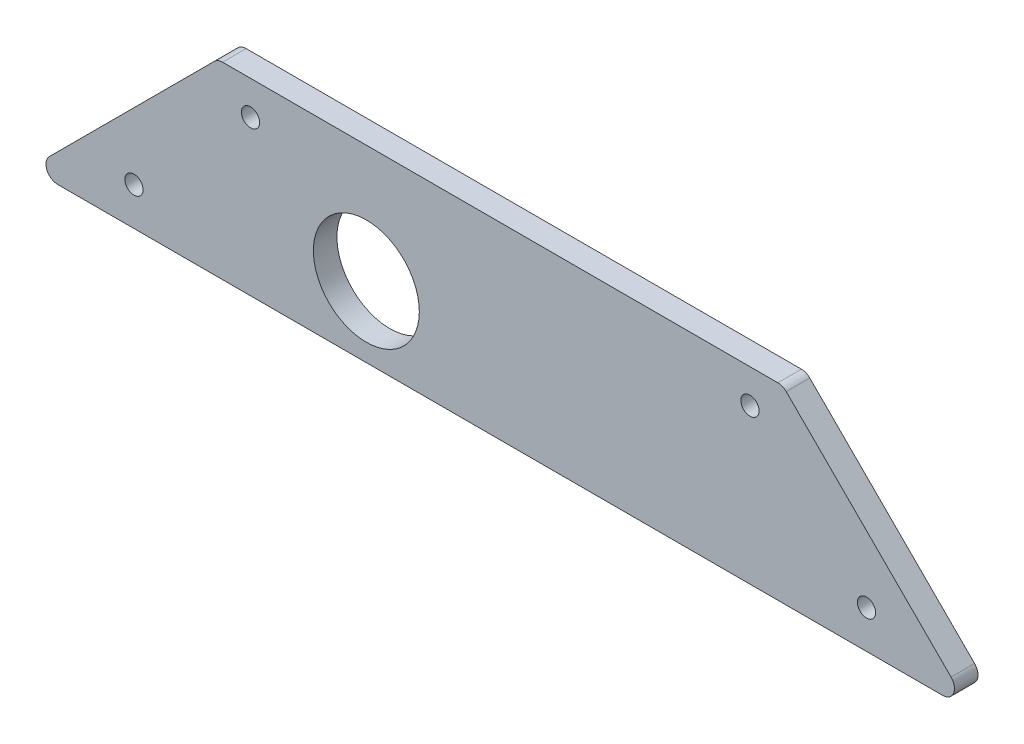
ISO-10303-21;
HEADER;
FILE_DESCRIPTION(('STEP AP214'),'2;1');
FILE_NAME('part.step','',(''),(''),'','','');
FILE_SCHEMA(('AUTOMOTIVE_DESIGN { 1 0 10303 214 1 1 1 1 }'));
ENDSEC;
DATA;
#1=APPLICATION_CONTEXT('core data for automotive mechanical design processes');
#2=APPLICATION_PROTOCOL_DEFINITION('international standard','automotive_design',2000,#1);
#3=PRODUCT_CONTEXT('',#1,'mechanical');
#4=PRODUCT('Part','Part','',(#3));
#5=PRODUCT_RELATED_PRODUCT_CATEGORY('part','',(#4));
#6=PRODUCT_DEFINITION_FORMATION('','',#4);
#7=PRODUCT_DEFINITION_CONTEXT('part definition',#1,'design');
#8=PRODUCT_DEFINITION('design','',#6,#7);
#9=PRODUCT_DEFINITION_SHAPE('','',#8);
#10=(LENGTH_UNIT() NAMED_UNIT(*) SI_UNIT(.MILLI.,.METRE.));
#11=(NAMED_UNIT(*) PLANE_ANGLE_UNIT() SI_UNIT($,.RADIAN.));
#12=(NAMED_UNIT(*) SI_UNIT($,.STERADIAN.) SOLID_ANGLE_UNIT());
#13=UNCERTAINTY_MEASURE_WITH_UNIT(LENGTH_MEASURE(1.E-05),#10,'distance_accuracy_value','');
#14=(GEOMETRIC_REPRESENTATION_CONTEXT(3) GLOBAL_UNCERTAINTY_ASSIGNED_CONTEXT((#13)) GLOBAL_UNIT_ASSIGNED_CONTEXT((#10,
#11,#12)) REPRESENTATION_CONTEXT('',''));
#15=CARTESIAN_POINT('',(0.,0.,0.));
#16=DIRECTION('',(0.,0.,1.));
#17=DIRECTION('',(1.,0.,0.));
#18=AXIS2_PLACEMENT_3D('',#15,#16,#17);
#19=CARTESIAN_POINT('',(-76.1999999999995,29.1621533831808,3.175));
#20=DIRECTION('',(0.,-1.,0.));
#21=DIRECTION('',(1.,0.,0.));
#22=AXIS2_PLACEMENT_3D('',#19,#20,#21);
#23=PLANE('',#22);
#24=DIRECTION('',(-1.,0.,0.));
#25=VECTOR('',#24,1.);
#26=CARTESIAN_POINT('',(-76.1999999999995,29.1621533831808,-3.175));
#27=LINE('',#26,#25);
#28=CARTESIAN_POINT('',(74.8848719394649,29.1621533831808,-3.175));
#29=VERTEX_POINT('',#28);
#30=CARTESIAN_POINT('',(-74.8848719394649,29.1621533831808,-3.175));
#31=VERTEX_POINT('',#30);
#32=EDGE_CURVE('E132',#29,#31,#27,.T.);
#33=ORIENTED_EDGE('',*,*,#32,.T.);
#34=DIRECTION('',(0.,0.,-1.));
#35=VECTOR('',#34,1.);
#36=CARTESIAN_POINT('',(-74.8848719394649,29.1621533831808,3.175));
#37=LINE('',#36,#35);
#38=CARTESIAN_POINT('',(-74.8848719394649,29.1621533831808,3.175));
#39=VERTEX_POINT('',#38);
#40=EDGE_CURVE('E154',#31,#39,#37,.F.);
#41=ORIENTED_EDGE('',*,*,#40,.T.);
#42=DIRECTION('',(-1.,0.,0.));
#43=VECTOR('',#42,1.);
#44=CARTESIAN_POINT('',(-76.1999999999995,29.1621533831808,3.175));
#45=LINE('',#44,#43);
#46=CARTESIAN_POINT('',(74.8848719394649,29.1621533831808,3.175));
#47=VERTEX_POINT('',#46);
#48=EDGE_CURVE('E130',#47,#39,#45,.T.);
#49=ORIENTED_EDGE('',*,*,#48,.F.);
#50=DIRECTION('',(0.,0.,-1.));
#51=VECTOR('',#50,1.);
#52=CARTESIAN_POINT('',(74.8848719394649,29.1621533831808,3.175));
#53=LINE('',#52,#51);
#54=EDGE_CURVE('E151',#47,#29,#53,.T.);
#55=ORIENTED_EDGE('',*,*,#54,.T.);
#56=EDGE_LOOP('',(#33,#41,#49,#55));
#57=FACE_BOUND('',#56,.T.);
#58=ADVANCED_FACE('F35',(#57),#23,.F.);
#59=CARTESIAN_POINT('',(-76.1999999999995,29.1621533831808,3.175));
#60=DIRECTION('',(0.707106781186544,-0.707106781186551,0.));
#61=DIRECTION('',(0.707106781186551,0.707106781186544,0.));
#62=AXIS2_PLACEMENT_3D('',#59,#60,#61);
#63=PLANE('',#62);
#64=DIRECTION('',(-0.707106781186551,-0.707106781186544,0.));
#65=VECTOR('',#64,1.);
#66=CARTESIAN_POINT('',(-76.1999999999995,29.1621533831808,-3.175));
#67=LINE('',#66,#65);
#68=CARTESIAN_POINT('',(-77.1299359697322,28.2322174134481,-3.175));
#69=VERTEX_POINT('',#68);
#70=CARTESIAN_POINT('',(-121.579935969733,-16.2177825865519,-3.175));
#71=VERTEX_POINT('',#70);
#72=EDGE_CURVE('E128',#69,#71,#67,.T.);
#73=ORIENTED_EDGE('',*,*,#72,.T.);
#74=DIRECTION('',(0.,0.,-1.));
#75=VECTOR('',#74,1.);
#76=CARTESIAN_POINT('',(-121.579935969733,-16.2177825865519,3.175));
#77=LINE('',#76,#75);
#78=CARTESIAN_POINT('',(-121.579935969733,-16.2177825865519,3.175));
#79=VERTEX_POINT('',#78);
#80=EDGE_CURVE('E106',#71,#79,#77,.F.);
#81=ORIENTED_EDGE('',*,*,#80,.T.);
#82=DIRECTION('',(-0.707106781186551,-0.707106781186544,0.));
#83=VECTOR('',#82,1.);
#84=CARTESIAN_POINT('',(-76.1999999999995,29.1621533831808,3.175));
#85=LINE('',#84,#83);
#86=CARTESIAN_POINT('',(-77.1299359697322,28.2322174134481,3.175));
#87=VERTEX_POINT('',#86);
#88=EDGE_CURVE('E168',#87,#79,#85,.T.);
#89=ORIENTED_EDGE('',*,*,#88,.F.);
#90=DIRECTION('',(0.,0.,-1.));
#91=VECTOR('',#90,1.);
#92=CARTESIAN_POINT('',(-77.1299359697322,28.2322174134481,3.175));
#93=LINE('',#92,#91);
#94=EDGE_CURVE('E111',#87,#69,#93,.T.);
#95=ORIENTED_EDGE('',*,*,#94,.T.);
#96=EDGE_LOOP('',(#73,#81,#89,#95));
#97=FACE_BOUND('',#96,.T.);
#98=ADVANCED_FACE('F173',(#97),#63,.F.);
#99=CARTESIAN_POINT('',(-127.,-21.6378466168192,3.175));
#100=DIRECTION('',(0.,1.,0.));
#101=DIRECTION('',(0.,0.,1.));
#102=AXIS2_PLACEMENT_3D('',#99,#100,#101);
#103=PLANE('',#102);
#104=DIRECTION('',(1.,0.,0.));
#105=VECTOR('',#104,1.);
#106=CARTESIAN_POINT('',(-127.,-21.6378466168192,3.175));
#107=LINE('',#106,#105);
#108=CARTESIAN_POINT('',(-119.334871939465,-21.6378466168192,3.175));
#109=VERTEX_POINT('',#108);
#110=CARTESIAN_POINT('',(119.334871939465,-21.6378466168192,3.175));
#111=VERTEX_POINT('',#110);
#112=EDGE_CURVE('E120',#109,#111,#107,.T.);
#113=ORIENTED_EDGE('',*,*,#112,.F.);
#114=DIRECTION('',(0.,0.,-1.));
#115=VECTOR('',#114,1.);
#116=CARTESIAN_POINT('',(-119.334871939465,-21.6378466168192,3.175));
#117=LINE('',#116,#115);
#118=CARTESIAN_POINT('',(-119.334871939465,-21.6378466168192,-3.175));
#119=VERTEX_POINT('',#118);
#120=EDGE_CURVE('E105',#109,#119,#117,.T.);
#121=ORIENTED_EDGE('',*,*,#120,.T.);
#122=DIRECTION('',(1.,0.,0.));
#123=VECTOR('',#122,1.);
#124=CARTESIAN_POINT('',(-127.,-21.6378466168192,-3.175));
#125=LINE('',#124,#123);
#126=CARTESIAN_POINT('',(119.334871939465,-21.6378466168192,-3.175));
#127=VERTEX_POINT('',#126);
#128=EDGE_CURVE('E118',#119,#127,#125,.T.);
#129=ORIENTED_EDGE('',*,*,#128,.T.);
#130=DIRECTION('',(0.,0.,-1.));
#131=VECTOR('',#130,1.);
#132=CARTESIAN_POINT('',(119.334871939465,-21.6378466168192,3.175));
#133=LINE('',#132,#131);
#134=EDGE_CURVE('E122',#127,#111,#133,.F.);
#135=ORIENTED_EDGE('',*,*,#134,.T.);
#136=EDGE_LOOP('',(#113,#121,#129,#135));
#137=FACE_BOUND('',#136,.T.);
#138=ADVANCED_FACE('F117',(#137),#103,.F.);
#139=CARTESIAN_POINT('',(127.,-21.6378466168192,3.175));
#140=DIRECTION('',(-0.707106781186543,-0.707106781186551,0.));
#141=DIRECTION('',(0.707106781186551,-0.707106781186544,0.));
#142=AXIS2_PLACEMENT_3D('',#139,#140,#141);
#143=PLANE('',#142);
#144=DIRECTION('',(-0.707106781186552,0.707106781186544,0.));
#145=VECTOR('',#144,1.);
#146=CARTESIAN_POINT('',(127.,-21.6378466168192,3.175));
#147=LINE('',#146,#145);
#148=CARTESIAN_POINT('',(121.579935969733,-16.2177825865519,3.175));
#149=VERTEX_POINT('',#148);
#150=CARTESIAN_POINT('',(77.1299359697321,28.2322174134481,3.175));
#151=VERTEX_POINT('',#150);
#152=EDGE_CURVE('E136',#149,#151,#147,.T.);
#153=ORIENTED_EDGE('',*,*,#152,.F.);
#154=DIRECTION('',(0.,0.,-1.));
#155=VECTOR('',#154,1.);
#156=CARTESIAN_POINT('',(121.579935969733,-16.2177825865519,3.175));
#157=LINE('',#156,#155);
#158=CARTESIAN_POINT('',(121.579935969733,-16.2177825865519,-3.175));
#159=VERTEX_POINT('',#158);
#160=EDGE_CURVE('E11',#149,#159,#157,.T.);
#161=ORIENTED_EDGE('',*,*,#160,.T.);
#162=DIRECTION('',(-0.707106781186552,0.707106781186544,0.));
#163=VECTOR('',#162,1.);
#164=CARTESIAN_POINT('',(127.,-21.6378466168192,-3.175));
#165=LINE('',#164,#163);
#166=CARTESIAN_POINT('',(77.1299359697321,28.2322174134481,-3.175));
#167=VERTEX_POINT('',#166);
#168=EDGE_CURVE('E127',#159,#167,#165,.T.);
#169=ORIENTED_EDGE('',*,*,#168,.T.);
#170=DIRECTION('',(0.,0.,-1.));
#171=VECTOR('',#170,1.);
#172=CARTESIAN_POINT('',(77.1299359697322,28.2322174134481,3.175));
#173=LINE('',#172,#171);
#174=EDGE_CURVE('E43',#167,#151,#173,.F.);
#175=ORIENTED_EDGE('',*,*,#174,.T.);
#176=EDGE_LOOP('',(#153,#161,#169,#175));
#177=FACE_BOUND('',#176,.T.);
#178=ADVANCED_FACE('F213',(#177),#143,.F.);
#179=CARTESIAN_POINT('',(0.,0.,3.175));
#180=DIRECTION('',(0.,0.,1.));
#181=DIRECTION('',(1.,0.,0.));
#182=AXIS2_PLACEMENT_3D('',#179,#180,#181);
#183=PLANE('',#182);
#184=CARTESIAN_POINT('',(67.3519209080186,20.0497202330234,3.175));
#185=DIRECTION('',(0.,0.,1.));
#186=DIRECTION('',(1.,0.,0.));
#187=AXIS2_PLACEMENT_3D('',#184,#185,#186);
#188=CIRCLE('',#187,2.45744999999999);
#189=CARTESIAN_POINT('',(69.8093709080186,20.0497202330234,3.175));
#190=VERTEX_POINT('',#189);
#191=EDGE_CURVE('E205',#190,#190,#188,.T.);
#192=ORIENTED_EDGE('',*,*,#191,.F.);
#193=EDGE_LOOP('',(#192));
#194=FACE_BOUND('',#193,.T.);
#195=CARTESIAN_POINT('',(98.7828173317607,-11.3811761907187,3.175));
#196=DIRECTION('',(0.,0.,1.));
#197=DIRECTION('',(1.,0.,0.));
#198=AXIS2_PLACEMENT_3D('',#195,#196,#197);
#199=CIRCLE('',#198,2.45744999999999);
#200=CARTESIAN_POINT('',(101.240267331761,-11.3811761907187,3.175));
#201=VERTEX_POINT('',#200);
#202=EDGE_CURVE('E199',#201,#201,#199,.T.);
#203=ORIENTED_EDGE('',*,*,#202,.F.);
#204=EDGE_LOOP('',(#203));
#205=FACE_BOUND('',#204,.T.);
#206=CARTESIAN_POINT('',(-67.3519209080187,20.0497202330234,3.175));
#207=DIRECTION('',(0.,0.,1.));
#208=DIRECTION('',(1.,0.,0.));
#209=AXIS2_PLACEMENT_3D('',#206,#207,#208);
#210=CIRCLE('',#209,2.45744999999999);
#211=CARTESIAN_POINT('',(-64.8944709080187,20.0497202330234,3.175));
#212=VERTEX_POINT('',#211);
#213=EDGE_CURVE('E193',#212,#212,#210,.T.);
#214=ORIENTED_EDGE('',*,*,#213,.F.);
#215=EDGE_LOOP('',(#214));
#216=FACE_BOUND('',#215,.T.);
#217=CARTESIAN_POINT('',(-98.7828173317607,-11.3811761907187,3.175));
#218=DIRECTION('',(0.,0.,1.));
#219=DIRECTION('',(1.,0.,0.));
#220=AXIS2_PLACEMENT_3D('',#217,#218,#219);
#221=CIRCLE('',#220,2.45744999999999);
#222=CARTESIAN_POINT('',(-96.3253673317607,-11.3811761907187,3.175));
#223=VERTEX_POINT('',#222);
#224=EDGE_CURVE('E187',#223,#223,#221,.T.);
#225=ORIENTED_EDGE('',*,*,#224,.F.);
#226=EDGE_LOOP('',(#225));
#227=FACE_BOUND('',#226,.T.);
#228=CARTESIAN_POINT('',(-36.1079510314463,-2.58784661681916,3.175));
#229=DIRECTION('',(0.,0.,1.));
#230=DIRECTION('',(1.,0.,0.));
#231=AXIS2_PLACEMENT_3D('',#228,#229,#230);
#232=CIRCLE('',#231,14.2875);
#233=CARTESIAN_POINT('',(-21.8204510314463,-2.58784661681916,3.175));
#234=VERTEX_POINT('',#233);
#235=EDGE_CURVE('E176',#234,#234,#232,.T.);
#236=ORIENTED_EDGE('',*,*,#235,.F.);
#237=EDGE_LOOP('',(#236));
#238=FACE_BOUND('',#237,.T.);
#239=ORIENTED_EDGE('',*,*,#88,.T.);
#240=CARTESIAN_POINT('',(-119.334871939465,-18.4628466168192,3.175));
#241=DIRECTION('',(0.,0.,1.));
#242=DIRECTION('',(1.,0.,0.));
#243=AXIS2_PLACEMENT_3D('',#240,#241,#242);
#244=CIRCLE('',#243,3.175);
#245=EDGE_CURVE('E149',#79,#109,#244,.T.);
#246=ORIENTED_EDGE('',*,*,#245,.T.);
#247=ORIENTED_EDGE('',*,*,#112,.T.);
#248=CARTESIAN_POINT('',(119.334871939465,-18.4628466168192,3.175));
#249=DIRECTION('',(0.,0.,1.));
#250=DIRECTION('',(1.,0.,0.));
#251=AXIS2_PLACEMENT_3D('',#248,#249,#250);
#252=CIRCLE('',#251,3.175);
#253=EDGE_CURVE('E56',#111,#149,#252,.T.);
#254=ORIENTED_EDGE('',*,*,#253,.T.);
#255=ORIENTED_EDGE('',*,*,#152,.T.);
#256=CARTESIAN_POINT('',(74.8848719394649,25.9871533831808,3.175));
#257=DIRECTION('',(0.,0.,1.));
#258=DIRECTION('',(1.,0.,0.));
#259=AXIS2_PLACEMENT_3D('',#256,#257,#258);
#260=CIRCLE('',#259,3.175);
#261=EDGE_CURVE('E144',#151,#47,#260,.T.);
#262=ORIENTED_EDGE('',*,*,#261,.T.);
#263=ORIENTED_EDGE('',*,*,#48,.T.);
#264=CARTESIAN_POINT('',(-74.8848719394649,25.9871533831808,3.175));
#265=DIRECTION('',(0.,0.,1.));
#266=DIRECTION('',(1.,0.,0.));
#267=AXIS2_PLACEMENT_3D('',#264,#265,#266);
#268=CIRCLE('',#267,3.175);
#269=EDGE_CURVE('E147',#39,#87,#268,.T.);
#270=ORIENTED_EDGE('',*,*,#269,.T.);
#271=EDGE_LOOP('',(#239,#246,#247,#254,#255,#262,#263,#270));
#272=FACE_BOUND('',#271,.T.);
#273=ADVANCED_FACE('F165',(#194,#205,#216,#227,#238,#272),#183,.T.);
#274=CARTESIAN_POINT('',(0.,0.,-3.175));
#275=DIRECTION('',(0.,0.,1.));
#276=DIRECTION('',(1.,0.,0.));
#277=AXIS2_PLACEMENT_3D('',#274,#275,#276);
#278=PLANE('',#277);
#279=CARTESIAN_POINT('',(67.3519209080186,20.0497202330234,-3.17499999999999));
#280=DIRECTION('',(0.,0.,1.));
#281=DIRECTION('',(1.,0.,0.));
#282=AXIS2_PLACEMENT_3D('',#279,#280,#281);
#283=CIRCLE('',#282,2.45744999999999);
#284=CARTESIAN_POINT('',(69.8093709080186,20.0497202330234,-3.17499999999999));
#285=VERTEX_POINT('',#284);
#286=EDGE_CURVE('E202',#285,#285,#283,.T.);
#287=ORIENTED_EDGE('',*,*,#286,.T.);
#288=EDGE_LOOP('',(#287));
#289=FACE_BOUND('',#288,.T.);
#290=CARTESIAN_POINT('',(98.7828173317607,-11.3811761907187,-3.17499999999999));
#291=DIRECTION('',(0.,0.,1.));
#292=DIRECTION('',(1.,0.,0.));
#293=AXIS2_PLACEMENT_3D('',#290,#291,#292);
#294=CIRCLE('',#293,2.45744999999999);
#295=CARTESIAN_POINT('',(101.240267331761,-11.3811761907187,-3.17499999999999));
#296=VERTEX_POINT('',#295);
#297=EDGE_CURVE('E196',#296,#296,#294,.T.);
#298=ORIENTED_EDGE('',*,*,#297,.T.);
#299=EDGE_LOOP('',(#298));
#300=FACE_BOUND('',#299,.T.);
#301=CARTESIAN_POINT('',(-67.3519209080187,20.0497202330234,-3.17499999999999));
#302=DIRECTION('',(0.,0.,1.));
#303=DIRECTION('',(1.,0.,0.));
#304=AXIS2_PLACEMENT_3D('',#301,#302,#303);
#305=CIRCLE('',#304,2.45744999999999);
#306=CARTESIAN_POINT('',(-64.8944709080187,20.0497202330234,-3.17499999999999));
#307=VERTEX_POINT('',#306);
#308=EDGE_CURVE('E190',#307,#307,#305,.T.);
#309=ORIENTED_EDGE('',*,*,#308,.T.);
#310=EDGE_LOOP('',(#309));
#311=FACE_BOUND('',#310,.T.);
#312=CARTESIAN_POINT('',(-98.7828173317607,-11.3811761907187,-3.17499999999999));
#313=DIRECTION('',(0.,0.,1.));
#314=DIRECTION('',(1.,0.,0.));
#315=AXIS2_PLACEMENT_3D('',#312,#313,#314);
#316=CIRCLE('',#315,2.45744999999999);
#317=CARTESIAN_POINT('',(-96.3253673317607,-11.3811761907187,-3.17499999999999));
#318=VERTEX_POINT('',#317);
#319=EDGE_CURVE('E183',#318,#318,#316,.T.);
#320=ORIENTED_EDGE('',*,*,#319,.T.);
#321=EDGE_LOOP('',(#320));
#322=FACE_BOUND('',#321,.T.);
#323=CARTESIAN_POINT('',(-36.1079510314463,-2.58784661681916,-3.175));
#324=DIRECTION('',(0.,0.,1.));
#325=DIRECTION('',(1.,0.,0.));
#326=AXIS2_PLACEMENT_3D('',#323,#324,#325);
#327=CIRCLE('',#326,14.2875);
#328=CARTESIAN_POINT('',(-21.8204510314463,-2.58784661681916,-3.175));
#329=VERTEX_POINT('',#328);
#330=EDGE_CURVE('E174',#329,#329,#327,.T.);
#331=ORIENTED_EDGE('',*,*,#330,.T.);
#332=EDGE_LOOP('',(#331));
#333=FACE_BOUND('',#332,.T.);
#334=ORIENTED_EDGE('',*,*,#128,.F.);
#335=CARTESIAN_POINT('',(-119.334871939465,-18.4628466168192,-3.175));
#336=DIRECTION('',(0.,0.,1.));
#337=DIRECTION('',(1.,0.,0.));
#338=AXIS2_PLACEMENT_3D('',#335,#336,#337);
#339=CIRCLE('',#338,3.175);
#340=EDGE_CURVE('E101',#119,#71,#339,.F.);
#341=ORIENTED_EDGE('',*,*,#340,.T.);
#342=ORIENTED_EDGE('',*,*,#72,.F.);
#343=CARTESIAN_POINT('',(-74.8848719394649,25.9871533831808,-3.175));
#344=DIRECTION('',(0.,0.,1.));
#345=DIRECTION('',(1.,0.,0.));
#346=AXIS2_PLACEMENT_3D('',#343,#344,#345);
#347=CIRCLE('',#346,3.175);
#348=EDGE_CURVE('E112',#69,#31,#347,.F.);
#349=ORIENTED_EDGE('',*,*,#348,.T.);
#350=ORIENTED_EDGE('',*,*,#32,.F.);
#351=CARTESIAN_POINT('',(74.8848719394649,25.9871533831808,-3.175));
#352=DIRECTION('',(0.,0.,1.));
#353=DIRECTION('',(1.,0.,0.));
#354=AXIS2_PLACEMENT_3D('',#351,#352,#353);
#355=CIRCLE('',#354,3.175);
#356=EDGE_CURVE('E121',#29,#167,#355,.F.);
#357=ORIENTED_EDGE('',*,*,#356,.T.);
#358=ORIENTED_EDGE('',*,*,#168,.F.);
#359=CARTESIAN_POINT('',(119.334871939465,-18.4628466168192,-3.175));
#360=DIRECTION('',(0.,0.,1.));
#361=DIRECTION('',(1.,0.,0.));
#362=AXIS2_PLACEMENT_3D('',#359,#360,#361);
#363=CIRCLE('',#362,3.175);
#364=EDGE_CURVE('E126',#159,#127,#363,.F.);
#365=ORIENTED_EDGE('',*,*,#364,.T.);
#366=EDGE_LOOP('',(#334,#341,#342,#349,#350,#357,#358,#365));
#367=FACE_BOUND('',#366,.T.);
#368=ADVANCED_FACE('F124',(#289,#300,#311,#322,#333,#367),#278,.F.);
#369=CARTESIAN_POINT('',(-36.1079510314463,-2.58784661681916,-3.175));
#370=DIRECTION('',(0.,0.,1.));
#371=DIRECTION('',(1.,0.,0.));
#372=AXIS2_PLACEMENT_3D('',#369,#370,#371);
#373=CYLINDRICAL_SURFACE('',#372,14.2875);
#374=ORIENTED_EDGE('',*,*,#330,.F.);
#375=EDGE_LOOP('',(#374));
#376=FACE_BOUND('',#375,.T.);
#377=ORIENTED_EDGE('',*,*,#235,.T.);
#378=EDGE_LOOP('',(#377));
#379=FACE_BOUND('',#378,.T.);
#380=ADVANCED_FACE('F223',(#376,#379),#373,.F.);
#381=CARTESIAN_POINT('',(-98.7828173317607,-11.3811761907187,3.175));
#382=DIRECTION('',(0.,0.,1.));
#383=DIRECTION('',(1.,0.,0.));
#384=AXIS2_PLACEMENT_3D('',#381,#382,#383);
#385=CYLINDRICAL_SURFACE('',#384,2.45744999999999);
#386=ORIENTED_EDGE('',*,*,#319,.F.);
#387=EDGE_LOOP('',(#386));
#388=FACE_BOUND('',#387,.T.);
#389=ORIENTED_EDGE('',*,*,#224,.T.);
#390=EDGE_LOOP('',(#389));
#391=FACE_BOUND('',#390,.T.);
#392=ADVANCED_FACE('F225',(#388,#391),#385,.F.);
#393=CARTESIAN_POINT('',(-67.3519209080187,20.0497202330234,3.175));
#394=DIRECTION('',(0.,0.,1.));
#395=DIRECTION('',(1.,0.,0.));
#396=AXIS2_PLACEMENT_3D('',#393,#394,#395);
#397=CYLINDRICAL_SURFACE('',#396,2.45744999999999);
#398=ORIENTED_EDGE('',*,*,#308,.F.);
#399=EDGE_LOOP('',(#398));
#400=FACE_BOUND('',#399,.T.);
#401=ORIENTED_EDGE('',*,*,#213,.T.);
#402=EDGE_LOOP('',(#401));
#403=FACE_BOUND('',#402,.T.);
#404=ADVANCED_FACE('F232',(#400,#403),#397,.F.);
#405=CARTESIAN_POINT('',(98.7828173317607,-11.3811761907187,3.175));
#406=DIRECTION('',(0.,0.,1.));
#407=DIRECTION('',(1.,0.,0.));
#408=AXIS2_PLACEMENT_3D('',#405,#406,#407);
#409=CYLINDRICAL_SURFACE('',#408,2.45744999999999);
#410=ORIENTED_EDGE('',*,*,#297,.F.);
#411=EDGE_LOOP('',(#410));
#412=FACE_BOUND('',#411,.T.);
#413=ORIENTED_EDGE('',*,*,#202,.T.);
#414=EDGE_LOOP('',(#413));
#415=FACE_BOUND('',#414,.T.);
#416=ADVANCED_FACE('F281',(#412,#415),#409,.F.);
#417=CARTESIAN_POINT('',(67.3519209080186,20.0497202330234,3.175));
#418=DIRECTION('',(0.,0.,1.));
#419=DIRECTION('',(1.,0.,0.));
#420=AXIS2_PLACEMENT_3D('',#417,#418,#419);
#421=CYLINDRICAL_SURFACE('',#420,2.45744999999999);
#422=ORIENTED_EDGE('',*,*,#286,.F.);
#423=EDGE_LOOP('',(#422));
#424=FACE_BOUND('',#423,.T.);
#425=ORIENTED_EDGE('',*,*,#191,.T.);
#426=EDGE_LOOP('',(#425));
#427=FACE_BOUND('',#426,.T.);
#428=ADVANCED_FACE('F209',(#424,#427),#421,.F.);
#429=CARTESIAN_POINT('',(-119.334871939465,-18.4628466168192,3.175));
#430=DIRECTION('',(0.,0.,-1.));
#431=DIRECTION('',(-1.,0.,0.));
#432=AXIS2_PLACEMENT_3D('',#429,#430,#431);
#433=CYLINDRICAL_SURFACE('',#432,3.175);
#434=ORIENTED_EDGE('',*,*,#245,.F.);
#435=ORIENTED_EDGE('',*,*,#80,.F.);
#436=ORIENTED_EDGE('',*,*,#340,.F.);
#437=ORIENTED_EDGE('',*,*,#120,.F.);
#438=EDGE_LOOP('',(#434,#435,#436,#437));
#439=FACE_BOUND('',#438,.T.);
#440=ADVANCED_FACE('F104',(#439),#433,.T.);
#441=CARTESIAN_POINT('',(-74.8848719394649,25.9871533831808,3.175));
#442=DIRECTION('',(0.,0.,-1.));
#443=DIRECTION('',(-1.,0.,0.));
#444=AXIS2_PLACEMENT_3D('',#441,#442,#443);
#445=CYLINDRICAL_SURFACE('',#444,3.175);
#446=ORIENTED_EDGE('',*,*,#269,.F.);
#447=ORIENTED_EDGE('',*,*,#40,.F.);
#448=ORIENTED_EDGE('',*,*,#348,.F.);
#449=ORIENTED_EDGE('',*,*,#94,.F.);
#450=EDGE_LOOP('',(#446,#447,#448,#449));
#451=FACE_BOUND('',#450,.T.);
#452=ADVANCED_FACE('F171',(#451),#445,.T.);
#453=CARTESIAN_POINT('',(119.334871939465,-18.4628466168192,3.175));
#454=DIRECTION('',(0.,0.,-1.));
#455=DIRECTION('',(-1.,0.,0.));
#456=AXIS2_PLACEMENT_3D('',#453,#454,#455);
#457=CYLINDRICAL_SURFACE('',#456,3.175);
#458=ORIENTED_EDGE('',*,*,#253,.F.);
#459=ORIENTED_EDGE('',*,*,#134,.F.);
#460=ORIENTED_EDGE('',*,*,#364,.F.);
#461=ORIENTED_EDGE('',*,*,#160,.F.);
#462=EDGE_LOOP('',(#458,#459,#460,#461));
#463=FACE_BOUND('',#462,.T.);
#464=ADVANCED_FACE('F249',(#463),#457,.T.);
#465=CARTESIAN_POINT('',(74.8848719394649,25.9871533831808,3.175));
#466=DIRECTION('',(0.,0.,-1.));
#467=DIRECTION('',(-1.,0.,0.));
#468=AXIS2_PLACEMENT_3D('',#465,#466,#467);
#469=CYLINDRICAL_SURFACE('',#468,3.175);
#470=ORIENTED_EDGE('',*,*,#261,.F.);
#471=ORIENTED_EDGE('',*,*,#174,.F.);
#472=ORIENTED_EDGE('',*,*,#356,.F.);
#473=ORIENTED_EDGE('',*,*,#54,.F.);
#474=EDGE_LOOP('',(#470,#471,#472,#473));
#475=FACE_BOUND('',#474,.T.);
#476=ADVANCED_FACE('F37',(#475),#469,.T.);
#477=CLOSED_SHELL('',(#58,#98,#138,#178,#273,#368,#380,#392,#404,#416,#428,#440,#452,#464,#476));
#478=MANIFOLD_SOLID_BREP('B2',#477);
#479=ADVANCED_BREP_SHAPE_REPRESENTATION('',(#18,#478),#14);
#480=SHAPE_DEFINITION_REPRESENTATION(#9,#479);
ENDSEC;
END-ISO-10303-21;
